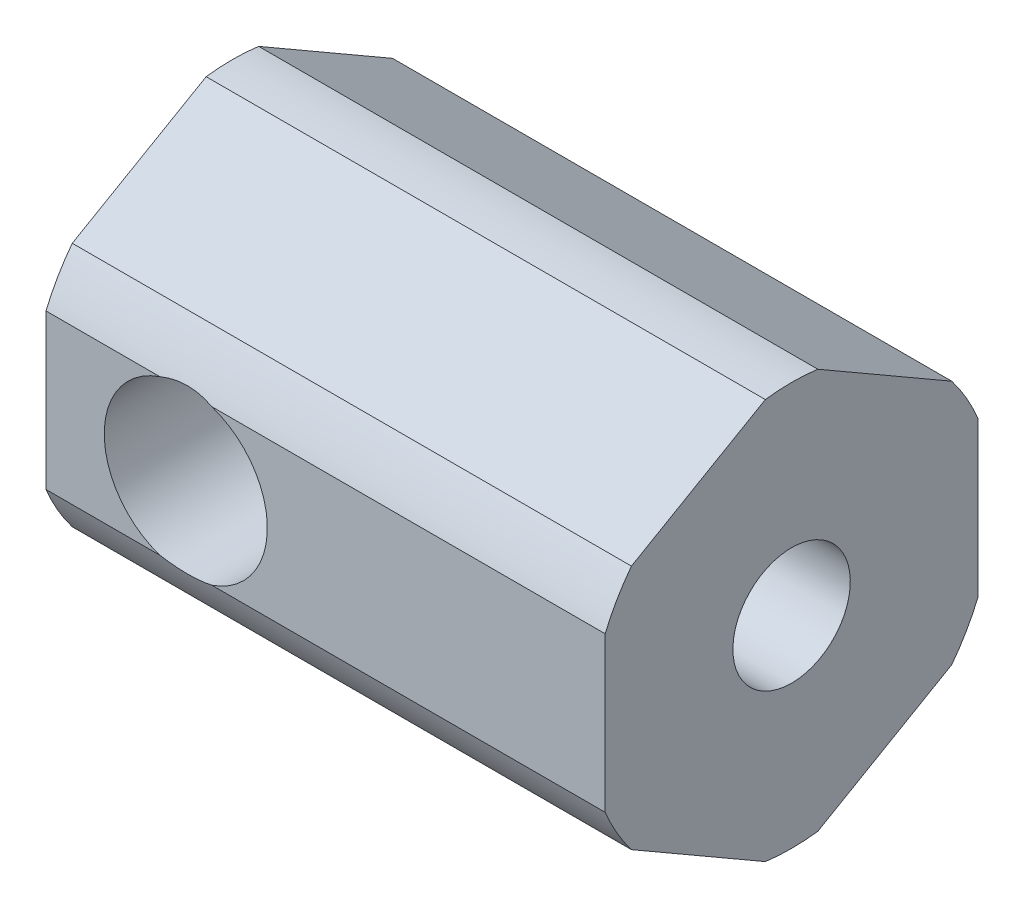
ISO-10303-21;
HEADER;
FILE_DESCRIPTION(('STEP AP214'),'2;1');
FILE_NAME('part.step','',(''),(''),'','','');
FILE_SCHEMA(('AUTOMOTIVE_DESIGN { 1 0 10303 214 1 1 1 1 }'));
ENDSEC;
DATA;
#1=APPLICATION_CONTEXT('core data for automotive mechanical design processes');
#2=APPLICATION_PROTOCOL_DEFINITION('international standard','automotive_design',2000,#1);
#3=PRODUCT_CONTEXT('',#1,'mechanical');
#4=PRODUCT('Part','Part','',(#3));
#5=PRODUCT_RELATED_PRODUCT_CATEGORY('part','',(#4));
#6=PRODUCT_DEFINITION_FORMATION('','',#4);
#7=PRODUCT_DEFINITION_CONTEXT('part definition',#1,'design');
#8=PRODUCT_DEFINITION('design','',#6,#7);
#9=PRODUCT_DEFINITION_SHAPE('','',#8);
#10=(LENGTH_UNIT() NAMED_UNIT(*) SI_UNIT(.MILLI.,.METRE.));
#11=(NAMED_UNIT(*) PLANE_ANGLE_UNIT() SI_UNIT($,.RADIAN.));
#12=(NAMED_UNIT(*) SI_UNIT($,.STERADIAN.) SOLID_ANGLE_UNIT());
#13=UNCERTAINTY_MEASURE_WITH_UNIT(LENGTH_MEASURE(1.E-05),#10,'distance_accuracy_value','');
#14=(GEOMETRIC_REPRESENTATION_CONTEXT(3) GLOBAL_UNCERTAINTY_ASSIGNED_CONTEXT((#13)) GLOBAL_UNIT_ASSIGNED_CONTEXT((#10,
#11,#12)) REPRESENTATION_CONTEXT('',''));
#15=CARTESIAN_POINT('',(0.,0.,0.));
#16=DIRECTION('',(0.,0.,1.));
#17=DIRECTION('',(1.,0.,0.));
#18=AXIS2_PLACEMENT_3D('',#15,#16,#17);
#19=CARTESIAN_POINT('',(317.5,5.62120492239514,412.750546965444));
#20=DIRECTION('',(0.,0.,1.));
#21=DIRECTION('',(1.,0.,0.));
#22=AXIS2_PLACEMENT_3D('',#19,#20,#21);
#23=PLANE('',#22);
#24=CARTESIAN_POINT('',(303.2125,5.62120492239515,412.750546965444));
#25=DIRECTION('',(0.,0.,1.));
#26=DIRECTION('',(1.,0.,0.));
#27=AXIS2_PLACEMENT_3D('',#24,#25,#26);
#28=CIRCLE('',#27,2.778125);
#29=CARTESIAN_POINT('',(302.32830529524,8.2548674367845,412.750546965444));
#30=VERTEX_POINT('',#29);
#31=CARTESIAN_POINT('',(302.32830529524,2.98754240800578,412.750546965444));
#32=VERTEX_POINT('',#31);
#33=EDGE_CURVE('E46',#30,#32,#28,.T.);
#34=ORIENTED_EDGE('',*,*,#33,.F.);
#35=DIRECTION('',(-1.,0.,0.));
#36=VECTOR('',#35,1.);
#37=CARTESIAN_POINT('',(317.5,8.2548674367845,412.750546965444));
#38=LINE('',#37,#36);
#39=CARTESIAN_POINT('',(298.45,8.25486743678451,412.750546965444));
#40=VERTEX_POINT('',#39);
#41=EDGE_CURVE('E150',#30,#40,#38,.T.);
#42=ORIENTED_EDGE('',*,*,#41,.T.);
#43=DIRECTION('',(0.,-1.,0.));
#44=VECTOR('',#43,1.);
#45=CARTESIAN_POINT('',(298.45,5.62120492239515,412.750546965444));
#46=LINE('',#45,#44);
#47=CARTESIAN_POINT('',(298.45,2.98754240800578,412.750546965444));
#48=VERTEX_POINT('',#47);
#49=EDGE_CURVE('E226',#40,#48,#46,.T.);
#50=ORIENTED_EDGE('',*,*,#49,.T.);
#51=DIRECTION('',(-1.,0.,0.));
#52=VECTOR('',#51,1.);
#53=CARTESIAN_POINT('',(317.5,2.98754240800578,412.750546965444));
#54=LINE('',#53,#52);
#55=EDGE_CURVE('E169',#48,#32,#54,.F.);
#56=ORIENTED_EDGE('',*,*,#55,.T.);
#57=EDGE_LOOP('',(#34,#42,#50,#56));
#58=FACE_BOUND('',#57,.T.);
#59=ADVANCED_FACE('F17',(#58),#23,.T.);
#60=CARTESIAN_POINT('',(317.5,5.62120492239514,400.049453034557));
#61=DIRECTION('',(0.,0.,-1.));
#62=DIRECTION('',(-1.,0.,0.));
#63=AXIS2_PLACEMENT_3D('',#60,#61,#62);
#64=PLANE('',#63);
#65=CARTESIAN_POINT('',(303.2125,5.62120492239515,400.049453034557));
#66=DIRECTION('',(0.,0.,-1.));
#67=DIRECTION('',(-1.,0.,0.));
#68=AXIS2_PLACEMENT_3D('',#65,#66,#67);
#69=CIRCLE('',#68,2.778125);
#70=CARTESIAN_POINT('',(304.096694704759,8.25486743678451,400.049453034557));
#71=VERTEX_POINT('',#70);
#72=CARTESIAN_POINT('',(304.096694704759,2.98754240800578,400.049453034557));
#73=VERTEX_POINT('',#72);
#74=EDGE_CURVE('E259',#71,#73,#69,.T.);
#75=ORIENTED_EDGE('',*,*,#74,.F.);
#76=DIRECTION('',(-1.,0.,0.));
#77=VECTOR('',#76,1.);
#78=CARTESIAN_POINT('',(317.5,8.2548674367845,400.049453034557));
#79=LINE('',#78,#77);
#80=CARTESIAN_POINT('',(317.5,8.2548674367845,400.049453034557));
#81=VERTEX_POINT('',#80);
#82=EDGE_CURVE('E250',#71,#81,#79,.F.);
#83=ORIENTED_EDGE('',*,*,#82,.T.);
#84=DIRECTION('',(0.,-1.,0.));
#85=VECTOR('',#84,1.);
#86=CARTESIAN_POINT('',(317.5,5.62120492239514,400.049453034557));
#87=LINE('',#86,#85);
#88=CARTESIAN_POINT('',(317.5,2.98754240800578,400.049453034557));
#89=VERTEX_POINT('',#88);
#90=EDGE_CURVE('E193',#81,#89,#87,.T.);
#91=ORIENTED_EDGE('',*,*,#90,.T.);
#92=DIRECTION('',(-1.,0.,0.));
#93=VECTOR('',#92,1.);
#94=CARTESIAN_POINT('',(317.5,2.98754240800578,400.049453034557));
#95=LINE('',#94,#93);
#96=EDGE_CURVE('E258',#89,#73,#95,.T.);
#97=ORIENTED_EDGE('',*,*,#96,.T.);
#98=EDGE_LOOP('',(#75,#83,#91,#97));
#99=FACE_BOUND('',#98,.T.);
#100=ADVANCED_FACE('F257',(#99),#64,.T.);
#101=CARTESIAN_POINT('',(317.5,5.62120492239514,406.4));
#102=DIRECTION('',(-1.,0.,0.));
#103=DIRECTION('',(0.,-1.,0.));
#104=AXIS2_PLACEMENT_3D('',#101,#102,#103);
#105=CYLINDRICAL_SURFACE('',#104,2.);
#106=CARTESIAN_POINT('',(305.140706035574,3.62120492239514,406.4));
#107=CARTESIAN_POINT('',(305.140706895317,3.62120537169358,406.447464187115));
#108=CARTESIAN_POINT('',(305.142469500399,3.62289996238032,406.494935366174));
#109=CARTESIAN_POINT('',(305.149410426069,3.62962846800055,406.589399483141));
#110=CARTESIAN_POINT('',(305.154590876521,3.63466446517621,406.636392104278));
#111=CARTESIAN_POINT('',(305.174904539095,3.65465323399401,406.77619425761));
#112=CARTESIAN_POINT('',(305.194808636035,3.67448620599872,406.867666079358));
#113=CARTESIAN_POINT('',(305.243469860334,3.72533197674626,407.043409730969));
#114=CARTESIAN_POINT('',(305.27211466068,3.75620373427114,407.127756506094));
#115=CARTESIAN_POINT('',(305.33482100214,3.82788297365953,407.289856496864));
#116=CARTESIAN_POINT('',(305.368881988646,3.86868943845046,407.367610386361));
#117=CARTESIAN_POINT('',(305.446214549948,3.9679780795606,407.530290942657));
#118=CARTESIAN_POINT('',(305.490013850068,4.02834103488389,407.613817873658));
#119=CARTESIAN_POINT('',(305.577428837164,4.16126026640048,407.77082136714));
#120=CARTESIAN_POINT('',(305.62104419933,4.23383277812174,407.844284307993));
#121=CARTESIAN_POINT('',(305.712394590113,4.40484903310879,407.992317654862));
#122=CARTESIAN_POINT('',(305.759448966434,4.50559800590432,408.064687408874));
#123=CARTESIAN_POINT('',(305.84356787655,4.72185378442466,408.190735055377));
#124=CARTESIAN_POINT('',(305.880653648815,4.83732842952648,408.244452759181));
#125=CARTESIAN_POINT('',(305.931801120119,5.04550055453562,408.317572908654));
#126=CARTESIAN_POINT('',(305.949406098386,5.13544420934148,408.34237983792));
#127=CARTESIAN_POINT('',(305.975709268452,5.3191553422896,408.379272234629));
#128=CARTESIAN_POINT('',(305.984414848218,5.4129195813562,408.391368254456));
#129=CARTESIAN_POINT('',(305.992169097128,5.60182865656173,408.402147770205));
#130=CARTESIAN_POINT('',(305.99119658355,5.6969760657386,408.400801845332));
#131=CARTESIAN_POINT('',(305.979634338165,5.88554178132404,408.384712744912));
#132=CARTESIAN_POINT('',(305.969042062571,5.97895962370966,408.369966025745));
#133=CARTESIAN_POINT('',(305.939572424645,6.15893439480515,408.328509837542));
#134=CARTESIAN_POINT('',(305.920928698326,6.24560891522018,408.302137306643));
#135=CARTESIAN_POINT('',(305.876788307396,6.41307281123091,408.238741461875));
#136=CARTESIAN_POINT('',(305.851290274618,6.49386100777966,408.201716021509));
#137=CARTESIAN_POINT('',(305.791920724439,6.65702244690744,408.113653746539));
#138=CARTESIAN_POINT('',(305.757433565615,6.73857414981744,408.061517098904));
#139=CARTESIAN_POINT('',(305.684290636648,6.8922226753611,407.947159833977));
#140=CARTESIAN_POINT('',(305.645630700896,6.9643098876899,407.884929108208));
#141=CARTESIAN_POINT('',(305.559173338025,7.11104801628954,407.739025747944));
#142=CARTESIAN_POINT('',(305.511016953932,7.18366738069274,407.653518892007));
#143=CARTESIAN_POINT('',(305.416698693781,7.31411738221255,407.470816312422));
#144=CARTESIAN_POINT('',(305.370536885821,7.37194751472381,407.373620190105));
#145=CARTESIAN_POINT('',(305.29534758253,7.46031144316976,407.190927621451));
#146=CARTESIAN_POINT('',(305.264791074958,7.49405481273215,407.107621875268));
#147=CARTESIAN_POINT('',(305.211855874972,7.55046905135659,406.934927576758));
#148=CARTESIAN_POINT('',(305.189459001865,7.57316457484261,406.845553080523));
#149=CARTESIAN_POINT('',(305.158926879488,7.60357712086379,406.676414844713));
#150=CARTESIAN_POINT('',(305.14913219624,7.61305641157429,406.597276890322));
#151=CARTESIAN_POINT('',(305.139441006845,7.6224369730677,406.437848312246));
#152=CARTESIAN_POINT('',(305.139537361707,7.62234515193109,406.357558561736));
#153=CARTESIAN_POINT('',(305.149591102517,7.61261091063204,406.198362161098));
#154=CARTESIAN_POINT('',(305.159531457182,7.60298498559335,406.119453361709));
#155=CARTESIAN_POINT('',(305.187749640099,7.57485685968205,405.964742876945));
#156=CARTESIAN_POINT('',(305.206039984903,7.55634133122278,405.888946042951));
#157=CARTESIAN_POINT('',(305.257567746266,7.50204996059242,405.711349390967));
#158=CARTESIAN_POINT('',(305.293858800221,7.46230813535131,405.611659910153));
#159=CARTESIAN_POINT('',(305.372900052801,7.36888923547796,405.421816880096));
#160=CARTESIAN_POINT('',(305.415662963373,7.31518458279047,405.33168270523));
#161=CARTESIAN_POINT('',(305.504287790127,7.1933141179811,405.159059532157));
#162=CARTESIAN_POINT('',(305.550202827384,7.12478751027719,405.076853038575));
#163=CARTESIAN_POINT('',(305.640050639554,6.97494161332744,404.923910179613));
#164=CARTESIAN_POINT('',(305.683985182285,6.89363403565091,404.853163432675));
#165=CARTESIAN_POINT('',(305.763769582116,6.7244624838918,404.728737332127));
#166=CARTESIAN_POINT('',(305.799957391594,6.63735453661263,404.674253851256));
#167=CARTESIAN_POINT('',(305.864800279682,6.45352862985894,404.57847305656));
#168=CARTESIAN_POINT('',(305.893457970021,6.35681401841665,404.537171169795));
#169=CARTESIAN_POINT('',(305.940846729547,6.15498037519884,404.469589669133));
#170=CARTESIAN_POINT('',(305.959497708057,6.04980106275421,404.443431130407));
#171=CARTESIAN_POINT('',(305.984470241029,5.8351871190781,404.408519585943));
#172=CARTESIAN_POINT('',(305.990803836434,5.72575675037043,404.399749581758));
#173=CARTESIAN_POINT('',(305.990462697995,5.52189059608287,404.400227178937));
#174=CARTESIAN_POINT('',(305.985437212376,5.42743599427074,404.407190388982));
#175=CARTESIAN_POINT('',(305.966127553934,5.24139216802798,404.434147709125));
#176=CARTESIAN_POINT('',(305.951842724371,5.14980314732796,404.454142743535));
#177=CARTESIAN_POINT('',(305.915421377362,4.97292977467503,404.505762910747));
#178=CARTESIAN_POINT('',(305.8933827918,4.88758213036002,404.537243157916));
#179=CARTESIAN_POINT('',(305.842988897007,4.72349548311032,404.610530787443));
#180=CARTESIAN_POINT('',(305.81463254982,4.64475756902817,404.652339866863));
#181=CARTESIAN_POINT('',(305.749133864791,4.48457037427358,404.751334112435));
#182=CARTESIAN_POINT('',(305.711320794603,4.40421425399373,404.809838312714));
#183=CARTESIAN_POINT('',(305.632321839449,4.25384485152361,404.937108903496));
#184=CARTESIAN_POINT('',(305.591131092509,4.18384690039413,405.005890208593));
#185=CARTESIAN_POINT('',(305.500459576167,4.04276422441132,405.166317452104));
#186=CARTESIAN_POINT('',(305.450856773577,3.97388078800037,405.25983860921));
#187=CARTESIAN_POINT('',(305.356224920003,3.85249713078575,405.459121763776));
#188=CARTESIAN_POINT('',(305.311191730806,3.7999819960142,405.564872497078));
#189=CARTESIAN_POINT('',(305.244604505648,3.72641816573297,405.754400448143));
#190=CARTESIAN_POINT('',(305.220056608453,3.70065590402558,405.835288826414));
#191=CARTESIAN_POINT('',(305.179791483479,3.65942260746458,406.001641199945));
#192=CARTESIAN_POINT('',(305.16404383631,3.64391608754395,406.087088300807));
#193=CARTESIAN_POINT('',(305.149573068825,3.6297841796551,406.211137046404));
#194=CARTESIAN_POINT('',(305.146261139571,3.6265735549452,406.248747818711));
#195=CARTESIAN_POINT('',(305.141826966867,3.62228344240362,406.324237526925));
#196=CARTESIAN_POINT('',(305.140705349371,3.62120456378833,406.362116536386));
#197=CARTESIAN_POINT('',(305.140706035574,3.62120492239514,406.4));
#198=B_SPLINE_CURVE_WITH_KNOTS('',3,(#106,#107,#108,#109,#110,#111,#112,#113,#114,#115,#116,
#117,#118,#119,#120,#121,#122,#123,#124,#125,#126,#127,#128,#129,#130,#131,#132,#133,#134,#135,
#136,#137,#138,#139,#140,#141,#142,#143,#144,#145,#146,#147,#148,#149,#150,#151,#152,#153,#154,
#155,#156,#157,#158,#159,#160,#161,#162,#163,#164,#165,#166,#167,#168,#169,#170,#171,#172,#173,
#174,#175,#176,#177,#178,#179,#180,#181,#182,#183,#184,#185,#186,#187,#188,#189,#190,#191,#192,
#193,#194,#195,#196,#197),.UNSPECIFIED.,.T.,.F.,(4,2,2,2,2,2,2,2,2,2,2,2,2,2,2,2,2,2,2,2,2,2,2,
2,2,2,2,2,2,2,2,2,2,2,2,2,2,2,2,2,2,2,2,2,2,4),(0.,0.142338885310436,0.284766554414298,
0.57009934576377,0.851909612569876,1.13369104097608,1.46844845660541,1.80365458255204,
2.19945910318433,2.59441354118623,2.87804699093686,3.16144478648557,3.4454629991199,
3.72955633756101,4.00590806926418,4.28231500367094,4.58943839153506,4.89687126155726,
5.26166976631038,5.62648071624814,5.91032898722216,6.19354088360029,6.43335655659553,
6.67299914055836,6.91222783755675,7.1518163194223,7.48983530552367,7.8285270546764,
8.17664271303301,8.52444122280521,8.84991136313234,9.17526846874738,9.50319219163337,
9.83079518896806,10.1139236584738,10.3970722116774,10.6767658298038,10.9565054331509,
11.2743728149628,11.5927060630197,11.9700163641148,12.3469818673311,12.6111917685455,
12.8744826481013,12.9880577443857,13.1016652937891),.UNSPECIFIED.);
#199=CARTESIAN_POINT('',(305.140706035574,3.62120492239514,406.4));
#200=VERTEX_POINT('',#199);
#201=EDGE_CURVE('E311',#200,#200,#198,.T.);
#202=ORIENTED_EDGE('',*,*,#201,.T.);
#203=EDGE_LOOP('',(#202));
#204=FACE_BOUND('',#203,.T.);
#205=CARTESIAN_POINT('',(317.5,5.62120492239514,406.4));
#206=DIRECTION('',(-1.,0.,0.));
#207=DIRECTION('',(0.,-1.,0.));
#208=AXIS2_PLACEMENT_3D('',#205,#206,#207);
#209=CIRCLE('',#208,2.);
#210=CARTESIAN_POINT('',(317.5,3.62120492239514,406.4));
#211=VERTEX_POINT('',#210);
#212=EDGE_CURVE('E175',#211,#211,#209,.T.);
#213=ORIENTED_EDGE('',*,*,#212,.F.);
#214=EDGE_LOOP('',(#213));
#215=FACE_BOUND('',#214,.T.);
#216=ADVANCED_FACE('F393',(#204,#215),#105,.F.);
#217=CARTESIAN_POINT('',(317.5,0.12146992239514,409.575273482722));
#218=DIRECTION('',(0.,-0.866025403784439,0.5));
#219=DIRECTION('',(0.,-0.5,-0.866025403784439));
#220=AXIS2_PLACEMENT_3D('',#217,#218,#219);
#221=PLANE('',#220);
#222=DIRECTION('',(0.,0.5,0.866025403784439));
#223=VECTOR('',#222,1.);
#224=CARTESIAN_POINT('',(317.5,0.12146992239514,409.575273482722));
#225=LINE('',#224,#223);
#226=CARTESIAN_POINT('',(317.5,-1.19536133479956,407.294454840265));
#227=VERTEX_POINT('',#226);
#228=CARTESIAN_POINT('',(317.5,1.43830117958982,411.856092125177));
#229=VERTEX_POINT('',#228);
#230=EDGE_CURVE('E179',#227,#229,#225,.T.);
#231=ORIENTED_EDGE('',*,*,#230,.T.);
#232=DIRECTION('',(-1.,0.,0.));
#233=VECTOR('',#232,1.);
#234=CARTESIAN_POINT('',(317.5,1.43830117958983,411.856092125177));
#235=LINE('',#234,#233);
#236=CARTESIAN_POINT('',(298.45,1.43830117958985,411.856092125178));
#237=VERTEX_POINT('',#236);
#238=EDGE_CURVE('E166',#229,#237,#235,.T.);
#239=ORIENTED_EDGE('',*,*,#238,.T.);
#240=DIRECTION('',(0.,-0.5,-0.866025403784438));
#241=VECTOR('',#240,1.);
#242=CARTESIAN_POINT('',(298.45,0.121469922395147,409.575273482722));
#243=LINE('',#242,#241);
#244=CARTESIAN_POINT('',(298.45,-1.19536133479956,407.294454840265));
#245=VERTEX_POINT('',#244);
#246=EDGE_CURVE('E218',#237,#245,#243,.T.);
#247=ORIENTED_EDGE('',*,*,#246,.T.);
#248=DIRECTION('',(-1.,0.,0.));
#249=VECTOR('',#248,1.);
#250=CARTESIAN_POINT('',(317.5,-1.19536133479956,407.294454840265));
#251=LINE('',#250,#249);
#252=EDGE_CURVE('E159',#245,#227,#251,.F.);
#253=ORIENTED_EDGE('',*,*,#252,.T.);
#254=EDGE_LOOP('',(#231,#239,#247,#253));
#255=FACE_BOUND('',#254,.T.);
#256=ADVANCED_FACE('F19',(#255),#221,.T.);
#257=CARTESIAN_POINT('',(304.096694704759,2.98754240800578,412.750546965444));
#258=VERTEX_POINT('',#257);
#259=CARTESIAN_POINT('',(304.09669470476,8.2548674367845,412.750546965444));
#260=VERTEX_POINT('',#259);
#261=EDGE_CURVE('E134',#258,#260,#28,.T.);
#262=ORIENTED_EDGE('',*,*,#261,.F.);
#263=CARTESIAN_POINT('',(317.5,2.98754240800578,412.750546965444));
#264=VERTEX_POINT('',#263);
#265=EDGE_CURVE('E277',#258,#264,#54,.F.);
#266=ORIENTED_EDGE('',*,*,#265,.T.);
#267=DIRECTION('',(0.,1.,0.));
#268=VECTOR('',#267,1.);
#269=CARTESIAN_POINT('',(317.5,5.62120492239514,412.750546965444));
#270=LINE('',#269,#268);
#271=CARTESIAN_POINT('',(317.5,8.2548674367845,412.750546965444));
#272=VERTEX_POINT('',#271);
#273=EDGE_CURVE('E157',#264,#272,#270,.T.);
#274=ORIENTED_EDGE('',*,*,#273,.T.);
#275=EDGE_CURVE('E147',#272,#260,#38,.T.);
#276=ORIENTED_EDGE('',*,*,#275,.T.);
#277=EDGE_LOOP('',(#262,#266,#274,#276));
#278=FACE_BOUND('',#277,.T.);
#279=ADVANCED_FACE('F155',(#278),#23,.T.);
#280=CARTESIAN_POINT('',(317.5,11.1209399223951,409.575273482722));
#281=DIRECTION('',(0.,0.866025403784439,0.5));
#282=DIRECTION('',(0.,-0.5,0.866025403784439));
#283=AXIS2_PLACEMENT_3D('',#280,#281,#282);
#284=PLANE('',#283);
#285=DIRECTION('',(0.,0.5,-0.866025403784438));
#286=VECTOR('',#285,1.);
#287=CARTESIAN_POINT('',(317.5,11.1209399223951,409.575273482722));
#288=LINE('',#287,#286);
#289=CARTESIAN_POINT('',(317.5,9.80410866520044,411.856092125177));
#290=VERTEX_POINT('',#289);
#291=CARTESIAN_POINT('',(317.5,12.4377711795898,407.294454840265));
#292=VERTEX_POINT('',#291);
#293=EDGE_CURVE('E185',#290,#292,#288,.T.);
#294=ORIENTED_EDGE('',*,*,#293,.T.);
#295=DIRECTION('',(-1.,0.,0.));
#296=VECTOR('',#295,1.);
#297=CARTESIAN_POINT('',(317.5,12.4377711795898,407.294454840265));
#298=LINE('',#297,#296);
#299=CARTESIAN_POINT('',(298.45,12.4377711795898,407.294454840265));
#300=VERTEX_POINT('',#299);
#301=EDGE_CURVE('E275',#292,#300,#298,.T.);
#302=ORIENTED_EDGE('',*,*,#301,.T.);
#303=DIRECTION('',(0.,-0.5,0.866025403784439));
#304=VECTOR('',#303,1.);
#305=CARTESIAN_POINT('',(298.45,11.1209399223951,409.575273482722));
#306=LINE('',#305,#304);
#307=CARTESIAN_POINT('',(298.45,9.80410866520047,411.856092125177));
#308=VERTEX_POINT('',#307);
#309=EDGE_CURVE('E331',#300,#308,#306,.T.);
#310=ORIENTED_EDGE('',*,*,#309,.T.);
#311=DIRECTION('',(-1.,0.,0.));
#312=VECTOR('',#311,1.);
#313=CARTESIAN_POINT('',(317.5,9.80410866520045,411.856092125177));
#314=LINE('',#313,#312);
#315=EDGE_CURVE('E274',#308,#290,#314,.F.);
#316=ORIENTED_EDGE('',*,*,#315,.T.);
#317=EDGE_LOOP('',(#294,#302,#310,#316));
#318=FACE_BOUND('',#317,.T.);
#319=ADVANCED_FACE('F398',(#318),#284,.T.);
#320=CARTESIAN_POINT('',(317.5,11.1209399223951,403.224726517278));
#321=DIRECTION('',(0.,0.866025403784439,-0.5));
#322=DIRECTION('',(0.,0.5,0.866025403784439));
#323=AXIS2_PLACEMENT_3D('',#320,#321,#322);
#324=PLANE('',#323);
#325=DIRECTION('',(0.,-0.5,-0.866025403784439));
#326=VECTOR('',#325,1.);
#327=CARTESIAN_POINT('',(317.5,11.1209399223951,403.224726517278));
#328=LINE('',#327,#326);
#329=CARTESIAN_POINT('',(317.5,12.4377711795898,405.505545159735));
#330=VERTEX_POINT('',#329);
#331=CARTESIAN_POINT('',(317.5,9.80410866520047,400.943907874822));
#332=VERTEX_POINT('',#331);
#333=EDGE_CURVE('E189',#330,#332,#328,.T.);
#334=ORIENTED_EDGE('',*,*,#333,.T.);
#335=DIRECTION('',(-1.,0.,0.));
#336=VECTOR('',#335,1.);
#337=CARTESIAN_POINT('',(317.5,9.80410866520045,400.943907874822));
#338=LINE('',#337,#336);
#339=CARTESIAN_POINT('',(298.45,9.80410866520045,400.943907874822));
#340=VERTEX_POINT('',#339);
#341=EDGE_CURVE('E252',#332,#340,#338,.T.);
#342=ORIENTED_EDGE('',*,*,#341,.T.);
#343=DIRECTION('',(0.,0.5,0.866025403784438));
#344=VECTOR('',#343,1.);
#345=CARTESIAN_POINT('',(298.45,11.1209399223951,403.224726517278));
#346=LINE('',#345,#344);
#347=CARTESIAN_POINT('',(298.45,12.4377711795899,405.505545159735));
#348=VERTEX_POINT('',#347);
#349=EDGE_CURVE('E327',#340,#348,#346,.T.);
#350=ORIENTED_EDGE('',*,*,#349,.T.);
#351=DIRECTION('',(-1.,0.,0.));
#352=VECTOR('',#351,1.);
#353=CARTESIAN_POINT('',(317.5,12.4377711795898,405.505545159735));
#354=LINE('',#353,#352);
#355=EDGE_CURVE('E270',#348,#330,#354,.F.);
#356=ORIENTED_EDGE('',*,*,#355,.T.);
#357=EDGE_LOOP('',(#334,#342,#350,#356));
#358=FACE_BOUND('',#357,.T.);
#359=ADVANCED_FACE('F402',(#358),#324,.T.);
#360=CARTESIAN_POINT('',(302.32830529524,2.98754240800578,400.049453034557));
#361=VERTEX_POINT('',#360);
#362=CARTESIAN_POINT('',(302.32830529524,8.2548674367845,400.049453034557));
#363=VERTEX_POINT('',#362);
#364=EDGE_CURVE('E39',#361,#363,#69,.T.);
#365=ORIENTED_EDGE('',*,*,#364,.F.);
#366=CARTESIAN_POINT('',(298.45,2.98754240800578,400.049453034557));
#367=VERTEX_POINT('',#366);
#368=EDGE_CURVE('E265',#361,#367,#95,.T.);
#369=ORIENTED_EDGE('',*,*,#368,.T.);
#370=DIRECTION('',(0.,1.,0.));
#371=VECTOR('',#370,1.);
#372=CARTESIAN_POINT('',(298.45,5.62120492239515,400.049453034557));
#373=LINE('',#372,#371);
#374=CARTESIAN_POINT('',(298.45,8.25486743678451,400.049453034557));
#375=VERTEX_POINT('',#374);
#376=EDGE_CURVE('E323',#367,#375,#373,.T.);
#377=ORIENTED_EDGE('',*,*,#376,.T.);
#378=EDGE_CURVE('E261',#375,#363,#79,.F.);
#379=ORIENTED_EDGE('',*,*,#378,.T.);
#380=EDGE_LOOP('',(#365,#369,#377,#379));
#381=FACE_BOUND('',#380,.T.);
#382=ADVANCED_FACE('F395',(#381),#64,.T.);
#383=CARTESIAN_POINT('',(317.5,0.121469922395142,403.224726517278));
#384=DIRECTION('',(0.,-0.866025403784438,-0.5));
#385=DIRECTION('',(0.,0.5,-0.866025403784439));
#386=AXIS2_PLACEMENT_3D('',#383,#384,#385);
#387=PLANE('',#386);
#388=DIRECTION('',(0.,-0.5,0.866025403784438));
#389=VECTOR('',#388,1.);
#390=CARTESIAN_POINT('',(317.5,0.121469922395142,403.224726517278));
#391=LINE('',#390,#389);
#392=CARTESIAN_POINT('',(317.5,1.43830117958984,400.943907874822));
#393=VERTEX_POINT('',#392);
#394=CARTESIAN_POINT('',(317.5,-1.19536133479957,405.505545159735));
#395=VERTEX_POINT('',#394);
#396=EDGE_CURVE('E32',#393,#395,#391,.T.);
#397=ORIENTED_EDGE('',*,*,#396,.T.);
#398=DIRECTION('',(-1.,0.,0.));
#399=VECTOR('',#398,1.);
#400=CARTESIAN_POINT('',(317.5,-1.19536133479956,405.505545159735));
#401=LINE('',#400,#399);
#402=CARTESIAN_POINT('',(298.45,-1.19536133479956,405.505545159735));
#403=VERTEX_POINT('',#402);
#404=EDGE_CURVE('E204',#395,#403,#401,.T.);
#405=ORIENTED_EDGE('',*,*,#404,.T.);
#406=DIRECTION('',(0.,0.5,-0.866025403784439));
#407=VECTOR('',#406,1.);
#408=CARTESIAN_POINT('',(298.45,0.121469922395144,403.224726517278));
#409=LINE('',#408,#407);
#410=CARTESIAN_POINT('',(298.45,1.43830117958982,400.943907874822));
#411=VERTEX_POINT('',#410);
#412=EDGE_CURVE('E320',#403,#411,#409,.T.);
#413=ORIENTED_EDGE('',*,*,#412,.T.);
#414=DIRECTION('',(-1.,0.,0.));
#415=VECTOR('',#414,1.);
#416=CARTESIAN_POINT('',(317.5,1.43830117958984,400.943907874822));
#417=LINE('',#416,#415);
#418=EDGE_CURVE('E206',#411,#393,#417,.F.);
#419=ORIENTED_EDGE('',*,*,#418,.T.);
#420=EDGE_LOOP('',(#397,#405,#413,#419));
#421=FACE_BOUND('',#420,.T.);
#422=ADVANCED_FACE('F202',(#421),#387,.T.);
#423=CARTESIAN_POINT('',(317.5,5.62120492239514,406.4));
#424=DIRECTION('',(-1.,0.,0.));
#425=DIRECTION('',(0.,-1.,0.));
#426=AXIS2_PLACEMENT_3D('',#423,#424,#425);
#427=PLANE('',#426);
#428=ORIENTED_EDGE('',*,*,#212,.T.);
#429=EDGE_LOOP('',(#428));
#430=FACE_BOUND('',#429,.T.);
#431=CARTESIAN_POINT('',(317.5,5.62120492239514,406.4));
#432=DIRECTION('',(-1.,0.,0.));
#433=DIRECTION('',(0.,-1.,0.));
#434=AXIS2_PLACEMENT_3D('',#431,#432,#433);
#435=CIRCLE('',#434,6.875);
#436=EDGE_CURVE('E220',#229,#264,#435,.T.);
#437=ORIENTED_EDGE('',*,*,#436,.F.);
#438=ORIENTED_EDGE('',*,*,#230,.F.);
#439=EDGE_CURVE('E215',#395,#227,#435,.T.);
#440=ORIENTED_EDGE('',*,*,#439,.F.);
#441=ORIENTED_EDGE('',*,*,#396,.F.);
#442=EDGE_CURVE('E213',#89,#393,#435,.T.);
#443=ORIENTED_EDGE('',*,*,#442,.F.);
#444=ORIENTED_EDGE('',*,*,#90,.F.);
#445=EDGE_CURVE('E223',#332,#81,#435,.T.);
#446=ORIENTED_EDGE('',*,*,#445,.F.);
#447=ORIENTED_EDGE('',*,*,#333,.F.);
#448=EDGE_CURVE('E235',#292,#330,#435,.T.);
#449=ORIENTED_EDGE('',*,*,#448,.F.);
#450=ORIENTED_EDGE('',*,*,#293,.F.);
#451=EDGE_CURVE('E231',#272,#290,#435,.T.);
#452=ORIENTED_EDGE('',*,*,#451,.F.);
#453=ORIENTED_EDGE('',*,*,#273,.F.);
#454=EDGE_LOOP('',(#437,#438,#440,#441,#443,#444,#446,#447,#449,#450,#452,#453));
#455=FACE_BOUND('',#454,.T.);
#456=ADVANCED_FACE('F211',(#430,#455),#427,.F.);
#457=CARTESIAN_POINT('',(301.284293964425,3.62120492239514,406.4));
#458=CARTESIAN_POINT('',(301.284293104682,3.62120537169358,406.352535812885));
#459=CARTESIAN_POINT('',(301.2825304996,3.62289996238032,406.305064633826));
#460=CARTESIAN_POINT('',(301.275589573931,3.62962846800053,406.210600516859));
#461=CARTESIAN_POINT('',(301.27040912348,3.63466446517617,406.163607895722));
#462=CARTESIAN_POINT('',(301.250095460905,3.65465323399397,406.02380574239));
#463=CARTESIAN_POINT('',(301.230191363965,3.67448620599874,405.932333920642));
#464=CARTESIAN_POINT('',(301.181530139665,3.72533197674628,405.756590269032));
#465=CARTESIAN_POINT('',(301.15288533932,3.75620373427109,405.672243493906));
#466=CARTESIAN_POINT('',(301.09017899786,3.82788297365945,405.510143503136));
#467=CARTESIAN_POINT('',(301.056118011354,3.86868943845039,405.432389613639));
#468=CARTESIAN_POINT('',(300.978785450052,3.96797807956062,405.269709057343));
#469=CARTESIAN_POINT('',(300.934986149931,4.02834103488398,405.186182126342));
#470=CARTESIAN_POINT('',(300.847571162836,4.16126026640057,405.029178632859));
#471=CARTESIAN_POINT('',(300.80395580067,4.23383277812175,404.955715692007));
#472=CARTESIAN_POINT('',(300.712605409886,4.40484903310874,404.807682345138));
#473=CARTESIAN_POINT('',(300.665551033566,4.50559800590431,404.735312591126));
#474=CARTESIAN_POINT('',(300.58143212345,4.72185378442469,404.609264944623));
#475=CARTESIAN_POINT('',(300.544346351184,4.83732842952651,404.55554724082));
#476=CARTESIAN_POINT('',(300.49319887988,5.04550055453562,404.482427091346));
#477=CARTESIAN_POINT('',(300.475593901614,5.13544420934147,404.457620162081));
#478=CARTESIAN_POINT('',(300.449290731548,5.31915534228959,404.420727765371));
#479=CARTESIAN_POINT('',(300.440585151782,5.4129195813562,404.408631745544));
#480=CARTESIAN_POINT('',(300.432830902872,5.60182865656175,404.397852229795));
#481=CARTESIAN_POINT('',(300.43380341645,5.69697606573863,404.399198154667));
#482=CARTESIAN_POINT('',(300.445365661835,5.88554178132406,404.415287255088));
#483=CARTESIAN_POINT('',(300.455957937428,5.97895962370967,404.430033974255));
#484=CARTESIAN_POINT('',(300.485427575355,6.15893439480518,404.471490162459));
#485=CARTESIAN_POINT('',(300.504071301674,6.24560891522025,404.497862693357));
#486=CARTESIAN_POINT('',(300.548211692604,6.41307281123097,404.561258538125));
#487=CARTESIAN_POINT('',(300.573709725382,6.49386100777966,404.598283978491));
#488=CARTESIAN_POINT('',(300.63307927556,6.65702244690744,404.686346253461));
#489=CARTESIAN_POINT('',(300.667566434385,6.73857414981752,404.738482901096));
#490=CARTESIAN_POINT('',(300.740709363352,6.89222267536119,404.852840166023));
#491=CARTESIAN_POINT('',(300.779369299104,6.9643098876899,404.915070891792));
#492=CARTESIAN_POINT('',(300.865826661974,7.11104801628952,405.060974252057));
#493=CARTESIAN_POINT('',(300.913983046068,7.18366738069281,405.146481107993));
#494=CARTESIAN_POINT('',(301.008301306219,7.31411738221263,405.329183687578));
#495=CARTESIAN_POINT('',(301.054463114179,7.37194751472382,405.426379809895));
#496=CARTESIAN_POINT('',(301.12965241747,7.4603114431698,405.609072378549));
#497=CARTESIAN_POINT('',(301.160208925042,7.49405481273225,405.692378124732));
#498=CARTESIAN_POINT('',(301.213144125028,7.55046905135668,405.865072423243));
#499=CARTESIAN_POINT('',(301.235540998135,7.57316457484262,405.954446919478));
#500=CARTESIAN_POINT('',(301.266073120512,7.60357712086377,406.123585155287));
#501=CARTESIAN_POINT('',(301.275867803761,7.6130564115743,406.202723109679));
#502=CARTESIAN_POINT('',(301.285558993155,7.62243697306775,406.362151687755));
#503=CARTESIAN_POINT('',(301.285462638293,7.62234515193113,406.442441438264));
#504=CARTESIAN_POINT('',(301.275408897482,7.61261091063201,406.601637838903));
#505=CARTESIAN_POINT('',(301.265468542817,7.60298498559325,406.680546638291));
#506=CARTESIAN_POINT('',(301.237250359901,7.57485685968196,406.835257123055));
#507=CARTESIAN_POINT('',(301.218960015097,7.55634133122277,406.91105395705));
#508=CARTESIAN_POINT('',(301.167432253734,7.50204996059243,407.088650609033));
#509=CARTESIAN_POINT('',(301.131141199779,7.46230813535119,407.188340089847));
#510=CARTESIAN_POINT('',(301.052099947199,7.36888923547784,407.378183119904));
#511=CARTESIAN_POINT('',(301.009337036626,7.31518458279044,407.46831729477));
#512=CARTESIAN_POINT('',(300.920712209872,7.193314117981,407.640940467843));
#513=CARTESIAN_POINT('',(300.874797172616,7.12478751027688,407.723146961425));
#514=CARTESIAN_POINT('',(300.784949360446,6.97494161332714,407.876089820388));
#515=CARTESIAN_POINT('',(300.741014817714,6.89363403565085,407.946836567325));
#516=CARTESIAN_POINT('',(300.661230417883,6.72446248389177,408.071262667873));
#517=CARTESIAN_POINT('',(300.625042608406,6.63735453661242,408.125746148744));
#518=CARTESIAN_POINT('',(300.560199720318,6.45352862985868,408.221526943439));
#519=CARTESIAN_POINT('',(300.531542029979,6.35681401841652,408.262828830205));
#520=CARTESIAN_POINT('',(300.484153270453,6.15498037519878,408.330410330867));
#521=CARTESIAN_POINT('',(300.465502291943,6.04980106275409,408.356568869592));
#522=CARTESIAN_POINT('',(300.440529758971,5.83518711907797,408.391480414057));
#523=CARTESIAN_POINT('',(300.434196163565,5.72575675037034,408.400250418242));
#524=CARTESIAN_POINT('',(300.434537302005,5.52189059608291,408.399772821063));
#525=CARTESIAN_POINT('',(300.439562787624,5.42743599427087,408.392809611018));
#526=CARTESIAN_POINT('',(300.458872446066,5.24139216802805,408.365852290875));
#527=CARTESIAN_POINT('',(300.473157275628,5.14980314732789,408.345857256465));
#528=CARTESIAN_POINT('',(300.509578622638,4.972929774675,408.294237089253));
#529=CARTESIAN_POINT('',(300.5316172082,4.88758213036016,408.262756842084));
#530=CARTESIAN_POINT('',(300.582011102993,4.72349548311047,408.189469212557));
#531=CARTESIAN_POINT('',(300.61036745018,4.64475756902816,408.147660133136));
#532=CARTESIAN_POINT('',(300.675866135209,4.48457037427357,408.048665887565));
#533=CARTESIAN_POINT('',(300.713679205397,4.40421425399391,407.990161687287));
#534=CARTESIAN_POINT('',(300.792678160551,4.25384485152378,407.862891096504));
#535=CARTESIAN_POINT('',(300.833868907491,4.18384690039411,407.794109791407));
#536=CARTESIAN_POINT('',(300.924540423833,4.04276422441124,407.633682547896));
#537=CARTESIAN_POINT('',(300.974143226423,3.97388078800049,407.54016139079));
#538=CARTESIAN_POINT('',(301.068775079996,3.85249713078591,407.340878236224));
#539=CARTESIAN_POINT('',(301.113808269193,3.7999819960142,407.235127502922));
#540=CARTESIAN_POINT('',(301.180395494351,3.72641816573294,407.045599551856));
#541=CARTESIAN_POINT('',(301.204943391547,3.7006559040256,406.964711173587));
#542=CARTESIAN_POINT('',(301.24520851652,3.65942260746461,406.798358800056));
#543=CARTESIAN_POINT('',(301.260956163689,3.64391608754394,406.712911699193));
#544=CARTESIAN_POINT('',(301.275426931175,3.62978417965509,406.588862953596));
#545=CARTESIAN_POINT('',(301.278738860429,3.6265735549452,406.551252181289));
#546=CARTESIAN_POINT('',(301.283173033133,3.62228344240362,406.475762473075));
#547=CARTESIAN_POINT('',(301.284294650628,3.62120456378833,406.437883463614));
#548=CARTESIAN_POINT('',(301.284293964425,3.62120492239514,406.4));
#549=B_SPLINE_CURVE_WITH_KNOTS('',3,(#457,#458,#459,#460,#461,#462,#463,#464,#465,#466,#467,
#468,#469,#470,#471,#472,#473,#474,#475,#476,#477,#478,#479,#480,#481,#482,#483,#484,#485,#486,
#487,#488,#489,#490,#491,#492,#493,#494,#495,#496,#497,#498,#499,#500,#501,#502,#503,#504,#505,
#506,#507,#508,#509,#510,#511,#512,#513,#514,#515,#516,#517,#518,#519,#520,#521,#522,#523,#524,
#525,#526,#527,#528,#529,#530,#531,#532,#533,#534,#535,#536,#537,#538,#539,#540,#541,#542,#543,
#544,#545,#546,#547,#548),.UNSPECIFIED.,.T.,.F.,(4,2,2,2,2,2,2,2,2,2,2,2,2,2,2,2,2,2,2,2,2,2,2,
2,2,2,2,2,2,2,2,2,2,2,2,2,2,2,2,2,2,2,2,2,2,4),(0.,0.142338885310249,0.284766554413992,
0.570099345763266,0.851909612569632,1.13369104097613,1.46844845660544,1.80365458255207,
2.19945910318421,2.59441354118605,2.87804699093672,3.16144478648544,3.44546299911978,
3.7295563375609,4.00590806926411,4.28231500367086,4.58943839153495,4.89687126155718,
5.26166976631029,5.62648071624797,5.91032898722223,6.19354088360053,6.43335655659572,
6.67299914055862,6.91222783755702,7.15181631942246,7.48983530552362,7.82852705467638,
8.17664271303329,8.52444122280551,8.84991136313241,9.17526846874725,9.50319219163334,
9.83079518896798,10.1139236584736,10.3970722116772,10.6767658298037,10.9565054331509,
11.2743728149626,11.5927060630195,11.9700163641147,12.3469818673311,12.6111917685455,
12.8744826481012,12.9880577443858,13.1016652937891),.UNSPECIFIED.);
#550=CARTESIAN_POINT('',(301.284293964425,3.62120492239514,406.4));
#551=VERTEX_POINT('',#550);
#552=EDGE_CURVE('E338',#551,#551,#549,.T.);
#553=ORIENTED_EDGE('',*,*,#552,.T.);
#554=EDGE_LOOP('',(#553));
#555=FACE_BOUND('',#554,.T.);
#556=CARTESIAN_POINT('',(298.45,5.62120492239515,406.4));
#557=DIRECTION('',(1.,0.,0.));
#558=DIRECTION('',(0.,1.,0.));
#559=AXIS2_PLACEMENT_3D('',#556,#557,#558);
#560=CIRCLE('',#559,2.);
#561=CARTESIAN_POINT('',(298.45,7.62120492239515,406.4));
#562=VERTEX_POINT('',#561);
#563=EDGE_CURVE('E304',#562,#562,#560,.T.);
#564=ORIENTED_EDGE('',*,*,#563,.F.);
#565=EDGE_LOOP('',(#564));
#566=FACE_BOUND('',#565,.T.);
#567=ADVANCED_FACE('F355',(#555,#566),#105,.F.);
#568=CARTESIAN_POINT('',(317.5,5.62120492239514,406.4));
#569=DIRECTION('',(-1.,0.,0.));
#570=DIRECTION('',(0.,-1.,0.));
#571=AXIS2_PLACEMENT_3D('',#568,#569,#570);
#572=CYLINDRICAL_SURFACE('',#571,6.875);
#573=CARTESIAN_POINT('',(304.096694704759,2.98754240800578,400.049453034557));
#574=CARTESIAN_POINT('',(304.027592742267,2.96433308190663,400.059085749624));
#575=CARTESIAN_POINT('',(303.957439313953,2.94381661771287,400.067736359492));
#576=CARTESIAN_POINT('',(303.815503537874,2.90832754467351,400.082855120361));
#577=CARTESIAN_POINT('',(303.743720942632,2.89335578415239,400.089322937388));
#578=CARTESIAN_POINT('',(303.601117219233,2.86947231130982,400.099702303825));
#579=CARTESIAN_POINT('',(303.530328436697,2.86039767770848,400.10368244941));
#580=CARTESIAN_POINT('',(303.388170995105,2.84772157357815,400.109255636497));
#581=CARTESIAN_POINT('',(303.316802349958,2.84411997213369,400.110848735097));
#582=CARTESIAN_POINT('',(303.168676805917,2.84236651904485,400.111623053783));
#583=CARTESIAN_POINT('',(303.091913466022,2.84463937044688,400.11061631908));
#584=CARTESIAN_POINT('',(302.938907970381,2.85552027033283,400.105824459335));
#585=CARTESIAN_POINT('',(302.862665951455,2.864129922008,400.102038631191));
#586=CARTESIAN_POINT('',(302.708909021421,2.88796249235355,400.091656785882));
#587=CARTESIAN_POINT('',(302.631431404025,2.90338814267249,400.084974751807));
#588=CARTESIAN_POINT('',(302.478330413055,2.94068283027914,400.069059984781));
#589=CARTESIAN_POINT('',(302.402706563098,2.96255019295896,400.059827914785));
#590=CARTESIAN_POINT('',(302.32830529524,2.98754240800577,400.049453034557));
#591=B_SPLINE_CURVE_WITH_KNOTS('',3,(#573,#574,#575,#576,#577,#578,#579,#580,#581,#582,#583,
#584,#585,#586,#587,#588,#589,#590),.UNSPECIFIED.,.F.,.F.,(4,2,2,2,2,2,2,2,4),(0.,
0.220539781804239,0.441113291665698,0.655299892141045,0.869481369171135,1.09957309551678,
1.32972305439078,1.56723490346962,1.8046850626242),.UNSPECIFIED.);
#592=EDGE_CURVE('E343',#73,#361,#591,.T.);
#593=ORIENTED_EDGE('',*,*,#592,.F.);
#594=ORIENTED_EDGE('',*,*,#96,.F.);
#595=ORIENTED_EDGE('',*,*,#442,.T.);
#596=ORIENTED_EDGE('',*,*,#418,.F.);
#597=CARTESIAN_POINT('',(298.45,5.62120492239515,406.4));
#598=DIRECTION('',(1.,0.,0.));
#599=DIRECTION('',(0.,1.,0.));
#600=AXIS2_PLACEMENT_3D('',#597,#598,#599);
#601=CIRCLE('',#600,6.875);
#602=EDGE_CURVE('E306',#411,#367,#601,.T.);
#603=ORIENTED_EDGE('',*,*,#602,.T.);
#604=ORIENTED_EDGE('',*,*,#368,.F.);
#605=EDGE_LOOP('',(#593,#594,#595,#596,#603,#604));
#606=FACE_BOUND('',#605,.T.);
#607=ADVANCED_FACE('F379',(#606),#572,.T.);
#608=ORIENTED_EDGE('',*,*,#252,.F.);
#609=EDGE_CURVE('E301',#245,#403,#601,.T.);
#610=ORIENTED_EDGE('',*,*,#609,.T.);
#611=ORIENTED_EDGE('',*,*,#404,.F.);
#612=ORIENTED_EDGE('',*,*,#439,.T.);
#613=EDGE_LOOP('',(#608,#610,#611,#612));
#614=FACE_BOUND('',#613,.T.);
#615=ADVANCED_FACE('F376',(#614),#572,.T.);
#616=CARTESIAN_POINT('',(302.32830529524,8.25486743678451,400.049453034557));
#617=CARTESIAN_POINT('',(302.397407257733,8.2780767628836,400.059085749624));
#618=CARTESIAN_POINT('',(302.467560686047,8.29859322707734,400.067736359491));
#619=CARTESIAN_POINT('',(302.609496462126,8.33408230011671,400.082855120361));
#620=CARTESIAN_POINT('',(302.681279057367,8.34905406063786,400.089322937388));
#621=CARTESIAN_POINT('',(302.823882780767,8.37293753348045,400.099702303825));
#622=CARTESIAN_POINT('',(302.894671563302,8.38201216708179,400.10368244941));
#623=CARTESIAN_POINT('',(303.036829004895,8.39468827121214,400.109255636497));
#624=CARTESIAN_POINT('',(303.108197650041,8.39828987265659,400.110848735097));
#625=CARTESIAN_POINT('',(303.256323194082,8.40004332574544,400.111623053783));
#626=CARTESIAN_POINT('',(303.333086533978,8.39777047434342,400.11061631908));
#627=CARTESIAN_POINT('',(303.486092029619,8.3868895744575,400.105824459335));
#628=CARTESIAN_POINT('',(303.562334048545,8.37827992278233,400.102038631191));
#629=CARTESIAN_POINT('',(303.716090978579,8.35444735243682,400.091656785882));
#630=CARTESIAN_POINT('',(303.793568595974,8.33902170211791,400.084974751807));
#631=CARTESIAN_POINT('',(303.946669586944,8.30172701451126,400.069059984781));
#632=CARTESIAN_POINT('',(304.022293436902,8.27985965183142,400.059827914784));
#633=CARTESIAN_POINT('',(304.096694704759,8.25486743678452,400.049453034557));
#634=B_SPLINE_CURVE_WITH_KNOTS('',3,(#616,#617,#618,#619,#620,#621,#622,#623,#624,#625,#626,
#627,#628,#629,#630,#631,#632,#633),.UNSPECIFIED.,.F.,.F.,(4,2,2,2,2,2,2,2,4),(0.,
0.220539781804314,0.441113291665952,0.655299892141298,0.86948136917161,1.09957309551709,
1.32972305439092,1.5672349034697,1.8046850626242),.UNSPECIFIED.);
#635=EDGE_CURVE('E152',#363,#71,#634,.T.);
#636=ORIENTED_EDGE('',*,*,#635,.F.);
#637=ORIENTED_EDGE('',*,*,#378,.F.);
#638=EDGE_CURVE('E310',#375,#340,#601,.T.);
#639=ORIENTED_EDGE('',*,*,#638,.T.);
#640=ORIENTED_EDGE('',*,*,#341,.F.);
#641=ORIENTED_EDGE('',*,*,#445,.T.);
#642=ORIENTED_EDGE('',*,*,#82,.F.);
#643=EDGE_LOOP('',(#636,#637,#639,#640,#641,#642));
#644=FACE_BOUND('',#643,.T.);
#645=ADVANCED_FACE('F249',(#644),#572,.T.);
#646=ORIENTED_EDGE('',*,*,#448,.T.);
#647=ORIENTED_EDGE('',*,*,#355,.F.);
#648=EDGE_CURVE('E305',#348,#300,#601,.T.);
#649=ORIENTED_EDGE('',*,*,#648,.T.);
#650=ORIENTED_EDGE('',*,*,#301,.F.);
#651=EDGE_LOOP('',(#646,#647,#649,#650));
#652=FACE_BOUND('',#651,.T.);
#653=ADVANCED_FACE('F387',(#652),#572,.T.);
#654=CARTESIAN_POINT('',(304.096694704759,8.2548674367845,412.750546965444));
#655=CARTESIAN_POINT('',(304.027592742267,8.27807676288365,412.740914250376));
#656=CARTESIAN_POINT('',(303.957439313953,8.29859322707741,412.732263640509));
#657=CARTESIAN_POINT('',(303.815503537874,8.33408230011678,412.717144879639));
#658=CARTESIAN_POINT('',(303.743720942632,8.3490540606379,412.710677062612));
#659=CARTESIAN_POINT('',(303.601117219233,8.37293753348047,412.700297696175));
#660=CARTESIAN_POINT('',(303.530328436697,8.38201216708182,412.69631755059));
#661=CARTESIAN_POINT('',(303.388170995105,8.39468827121214,412.690744363503));
#662=CARTESIAN_POINT('',(303.316802349958,8.3982898726566,412.689151264903));
#663=CARTESIAN_POINT('',(303.168676805917,8.40004332574544,412.688376946217));
#664=CARTESIAN_POINT('',(303.091913466022,8.39777047434341,412.68938368092));
#665=CARTESIAN_POINT('',(302.938907970381,8.38688957445748,412.694175540665));
#666=CARTESIAN_POINT('',(302.862665951455,8.3782799227823,412.697961368809));
#667=CARTESIAN_POINT('',(302.708909021421,8.35444735243675,412.708343214118));
#668=CARTESIAN_POINT('',(302.631431404025,8.33902170211781,412.715025248193));
#669=CARTESIAN_POINT('',(302.478330413055,8.30172701451116,412.730940015219));
#670=CARTESIAN_POINT('',(302.402706563098,8.27985965183134,412.740172085216));
#671=CARTESIAN_POINT('',(302.32830529524,8.25486743678452,412.750546965444));
#672=B_SPLINE_CURVE_WITH_KNOTS('',3,(#654,#655,#656,#657,#658,#659,#660,#661,#662,#663,#664,
#665,#666,#667,#668,#669,#670,#671),.UNSPECIFIED.,.F.,.F.,(4,2,2,2,2,2,2,2,4),(0.,
0.220539781804252,0.441113291665712,0.655299892141115,0.869481369171192,1.09957309551683,
1.32972305439083,1.56723490346967,1.80468506262432),.UNSPECIFIED.);
#673=EDGE_CURVE('E138',#260,#30,#672,.T.);
#674=ORIENTED_EDGE('',*,*,#673,.F.);
#675=ORIENTED_EDGE('',*,*,#275,.F.);
#676=ORIENTED_EDGE('',*,*,#451,.T.);
#677=ORIENTED_EDGE('',*,*,#315,.F.);
#678=EDGE_CURVE('E300',#308,#40,#601,.T.);
#679=ORIENTED_EDGE('',*,*,#678,.T.);
#680=ORIENTED_EDGE('',*,*,#41,.F.);
#681=EDGE_LOOP('',(#674,#675,#676,#677,#679,#680));
#682=FACE_BOUND('',#681,.T.);
#683=ADVANCED_FACE('F146',(#682),#572,.T.);
#684=CARTESIAN_POINT('',(302.32830529524,2.98754240800578,412.750546965444));
#685=CARTESIAN_POINT('',(302.397407257733,2.96433308190671,412.740914250376));
#686=CARTESIAN_POINT('',(302.467560686047,2.94381661771297,412.732263640509));
#687=CARTESIAN_POINT('',(302.609496462126,2.90832754467359,412.717144879639));
#688=CARTESIAN_POINT('',(302.681279057367,2.89335578415244,412.710677062612));
#689=CARTESIAN_POINT('',(302.823882780767,2.86947231130984,412.700297696175));
#690=CARTESIAN_POINT('',(302.894671563302,2.8603976777085,412.69631755059));
#691=CARTESIAN_POINT('',(303.036829004895,2.84772157357816,412.690744363503));
#692=CARTESIAN_POINT('',(303.108197650042,2.84411997213369,412.689151264903));
#693=CARTESIAN_POINT('',(303.256323194082,2.84236651904485,412.688376946217));
#694=CARTESIAN_POINT('',(303.333086533978,2.84463937044688,412.68938368092));
#695=CARTESIAN_POINT('',(303.486092029619,2.85552027033281,412.694175540665));
#696=CARTESIAN_POINT('',(303.562334048545,2.86412992200797,412.697961368809));
#697=CARTESIAN_POINT('',(303.716090978579,2.88796249235348,412.708343214118));
#698=CARTESIAN_POINT('',(303.793568595974,2.90338814267239,412.715025248193));
#699=CARTESIAN_POINT('',(303.946669586944,2.94068283027904,412.730940015219));
#700=CARTESIAN_POINT('',(304.022293436902,2.96255019295888,412.740172085216));
#701=CARTESIAN_POINT('',(304.096694704759,2.98754240800577,412.750546965444));
#702=B_SPLINE_CURVE_WITH_KNOTS('',3,(#684,#685,#686,#687,#688,#689,#690,#691,#692,#693,#694,
#695,#696,#697,#698,#699,#700,#701),.UNSPECIFIED.,.F.,.F.,(4,2,2,2,2,2,2,2,4),(0.,
0.220539781804378,0.441113291666016,0.655299892141473,0.869481369171664,1.09957309551713,
1.32972305439097,1.56723490346969,1.80468506262431),.UNSPECIFIED.);
#703=EDGE_CURVE('E11',#32,#258,#702,.T.);
#704=ORIENTED_EDGE('',*,*,#703,.F.);
#705=ORIENTED_EDGE('',*,*,#55,.F.);
#706=EDGE_CURVE('E293',#48,#237,#601,.T.);
#707=ORIENTED_EDGE('',*,*,#706,.T.);
#708=ORIENTED_EDGE('',*,*,#238,.F.);
#709=ORIENTED_EDGE('',*,*,#436,.T.);
#710=ORIENTED_EDGE('',*,*,#265,.F.);
#711=EDGE_LOOP('',(#704,#705,#707,#708,#709,#710));
#712=FACE_BOUND('',#711,.T.);
#713=ADVANCED_FACE('F292',(#712),#572,.T.);
#714=CARTESIAN_POINT('',(298.45,5.62120492239515,406.4));
#715=DIRECTION('',(1.,0.,0.));
#716=DIRECTION('',(0.,-1.,0.));
#717=AXIS2_PLACEMENT_3D('',#714,#715,#716);
#718=PLANE('',#717);
#719=ORIENTED_EDGE('',*,*,#563,.T.);
#720=EDGE_LOOP('',(#719));
#721=FACE_BOUND('',#720,.T.);
#722=ORIENTED_EDGE('',*,*,#678,.F.);
#723=ORIENTED_EDGE('',*,*,#309,.F.);
#724=ORIENTED_EDGE('',*,*,#648,.F.);
#725=ORIENTED_EDGE('',*,*,#349,.F.);
#726=ORIENTED_EDGE('',*,*,#638,.F.);
#727=ORIENTED_EDGE('',*,*,#376,.F.);
#728=ORIENTED_EDGE('',*,*,#602,.F.);
#729=ORIENTED_EDGE('',*,*,#412,.F.);
#730=ORIENTED_EDGE('',*,*,#609,.F.);
#731=ORIENTED_EDGE('',*,*,#246,.F.);
#732=ORIENTED_EDGE('',*,*,#706,.F.);
#733=ORIENTED_EDGE('',*,*,#49,.F.);
#734=EDGE_LOOP('',(#722,#723,#724,#725,#726,#727,#728,#729,#730,#731,#732,#733));
#735=FACE_BOUND('',#734,.T.);
#736=ADVANCED_FACE('F297',(#721,#735),#718,.F.);
#737=CARTESIAN_POINT('',(303.2125,5.62120492239515,387.350546965444));
#738=DIRECTION('',(0.,0.,1.));
#739=DIRECTION('',(1.,0.,0.));
#740=AXIS2_PLACEMENT_3D('',#737,#738,#739);
#741=CYLINDRICAL_SURFACE('',#740,2.778125);
#742=ORIENTED_EDGE('',*,*,#552,.F.);
#743=EDGE_LOOP('',(#742));
#744=FACE_BOUND('',#743,.T.);
#745=ORIENTED_EDGE('',*,*,#592,.T.);
#746=ORIENTED_EDGE('',*,*,#364,.T.);
#747=ORIENTED_EDGE('',*,*,#635,.T.);
#748=ORIENTED_EDGE('',*,*,#74,.T.);
#749=EDGE_LOOP('',(#745,#746,#747,#748));
#750=FACE_BOUND('',#749,.T.);
#751=ORIENTED_EDGE('',*,*,#673,.T.);
#752=ORIENTED_EDGE('',*,*,#33,.T.);
#753=ORIENTED_EDGE('',*,*,#703,.T.);
#754=ORIENTED_EDGE('',*,*,#261,.T.);
#755=EDGE_LOOP('',(#751,#752,#753,#754));
#756=FACE_BOUND('',#755,.T.);
#757=ORIENTED_EDGE('',*,*,#201,.F.);
#758=EDGE_LOOP('',(#757));
#759=FACE_BOUND('',#758,.T.);
#760=ADVANCED_FACE('F136',(#744,#750,#756,#759),#741,.F.);
#761=CLOSED_SHELL('',(#59,#100,#216,#256,#279,#319,#359,#382,#422,#456,#567,#607,#615,#645,#653,
#683,#713,#736,#760));
#762=MANIFOLD_SOLID_BREP('B1',#761);
#763=ADVANCED_BREP_SHAPE_REPRESENTATION('',(#18,#762),#14);
#764=SHAPE_DEFINITION_REPRESENTATION(#9,#763);
ENDSEC;
END-ISO-10303-21;
